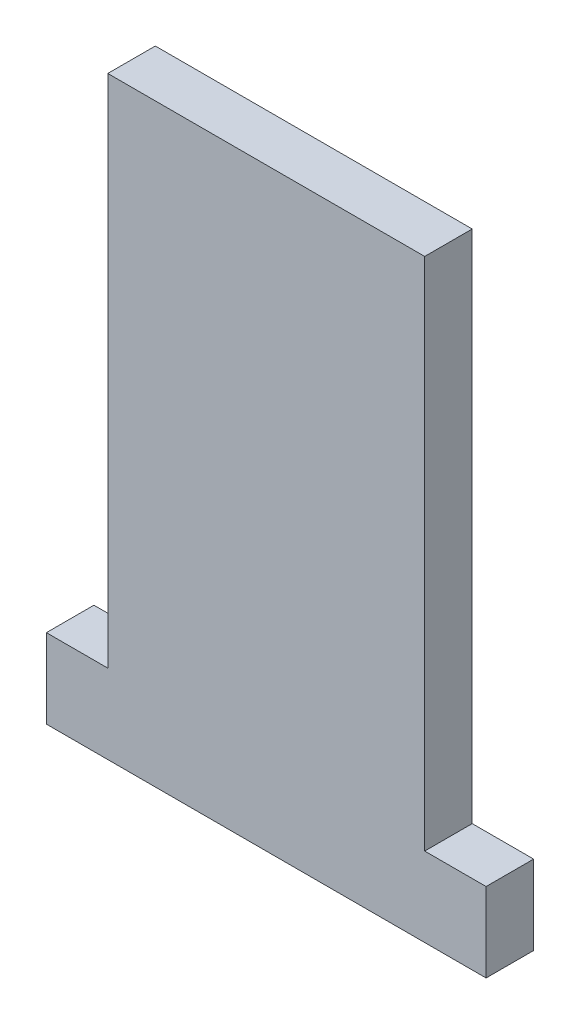
ISO-10303-21;
HEADER;
FILE_DESCRIPTION(('STEP AP214'),'2;1');
FILE_NAME('part.step','',(''),(''),'','','');
FILE_SCHEMA(('AUTOMOTIVE_DESIGN { 1 0 10303 214 1 1 1 1 }'));
ENDSEC;
DATA;
#1=APPLICATION_CONTEXT('core data for automotive mechanical design processes');
#2=APPLICATION_PROTOCOL_DEFINITION('international standard','automotive_design',2000,#1);
#3=PRODUCT_CONTEXT('',#1,'mechanical');
#4=PRODUCT('Part','Part','',(#3));
#5=PRODUCT_RELATED_PRODUCT_CATEGORY('part','',(#4));
#6=PRODUCT_DEFINITION_FORMATION('','',#4);
#7=PRODUCT_DEFINITION_CONTEXT('part definition',#1,'design');
#8=PRODUCT_DEFINITION('design','',#6,#7);
#9=PRODUCT_DEFINITION_SHAPE('','',#8);
#10=(LENGTH_UNIT() NAMED_UNIT(*) SI_UNIT(.MILLI.,.METRE.));
#11=(NAMED_UNIT(*) PLANE_ANGLE_UNIT() SI_UNIT($,.RADIAN.));
#12=(NAMED_UNIT(*) SI_UNIT($,.STERADIAN.) SOLID_ANGLE_UNIT());
#13=UNCERTAINTY_MEASURE_WITH_UNIT(LENGTH_MEASURE(1.E-05),#10,'distance_accuracy_value','');
#14=(GEOMETRIC_REPRESENTATION_CONTEXT(3) GLOBAL_UNCERTAINTY_ASSIGNED_CONTEXT((#13)) GLOBAL_UNIT_ASSIGNED_CONTEXT((#10,
#11,#12)) REPRESENTATION_CONTEXT('',''));
#15=CARTESIAN_POINT('',(0.,0.,0.));
#16=DIRECTION('',(0.,0.,1.));
#17=DIRECTION('',(1.,0.,0.));
#18=AXIS2_PLACEMENT_3D('',#15,#16,#17);
#19=CARTESIAN_POINT('',(4.,6.5,0.6));
#20=DIRECTION('',(-1.,0.,0.));
#21=DIRECTION('',(0.,-1.,0.));
#22=AXIS2_PLACEMENT_3D('',#19,#20,#21);
#23=PLANE('',#22);
#24=DIRECTION('',(0.,1.,0.));
#25=VECTOR('',#24,1.);
#26=CARTESIAN_POINT('',(4.,6.5,-0.6));
#27=LINE('',#26,#25);
#28=CARTESIAN_POINT('',(4.,-6.5,-0.6));
#29=VERTEX_POINT('',#28);
#30=CARTESIAN_POINT('',(4.,6.5,-0.6));
#31=VERTEX_POINT('',#30);
#32=EDGE_CURVE('E142',#29,#31,#27,.T.);
#33=ORIENTED_EDGE('',*,*,#32,.T.);
#34=DIRECTION('',(0.,0.,-1.));
#35=VECTOR('',#34,1.);
#36=CARTESIAN_POINT('',(4.,6.5,0.6));
#37=LINE('',#36,#35);
#38=CARTESIAN_POINT('',(4.,6.5,0.6));
#39=VERTEX_POINT('',#38);
#40=EDGE_CURVE('E11',#39,#31,#37,.T.);
#41=ORIENTED_EDGE('',*,*,#40,.F.);
#42=DIRECTION('',(0.,1.,0.));
#43=VECTOR('',#42,1.);
#44=CARTESIAN_POINT('',(4.,6.5,0.6));
#45=LINE('',#44,#43);
#46=CARTESIAN_POINT('',(4.,-6.5,0.6));
#47=VERTEX_POINT('',#46);
#48=EDGE_CURVE('E49',#47,#39,#45,.T.);
#49=ORIENTED_EDGE('',*,*,#48,.F.);
#50=DIRECTION('',(0.,0.,-1.));
#51=VECTOR('',#50,1.);
#52=CARTESIAN_POINT('',(4.,-6.5,0.6));
#53=LINE('',#52,#51);
#54=EDGE_CURVE('E67',#47,#29,#53,.T.);
#55=ORIENTED_EDGE('',*,*,#54,.T.);
#56=EDGE_LOOP('',(#33,#41,#49,#55));
#57=FACE_BOUND('',#56,.T.);
#58=ADVANCED_FACE('F33',(#57),#23,.F.);
#59=CARTESIAN_POINT('',(-4.,6.5,0.6));
#60=DIRECTION('',(0.,-1.,0.));
#61=DIRECTION('',(0.,0.,-1.));
#62=AXIS2_PLACEMENT_3D('',#59,#60,#61);
#63=PLANE('',#62);
#64=DIRECTION('',(-1.,0.,0.));
#65=VECTOR('',#64,1.);
#66=CARTESIAN_POINT('',(-4.,6.5,-0.6));
#67=LINE('',#66,#65);
#68=CARTESIAN_POINT('',(-4.,6.5,-0.6));
#69=VERTEX_POINT('',#68);
#70=EDGE_CURVE('E63',#31,#69,#67,.T.);
#71=ORIENTED_EDGE('',*,*,#70,.T.);
#72=DIRECTION('',(0.,0.,-1.));
#73=VECTOR('',#72,1.);
#74=CARTESIAN_POINT('',(-4.,6.5,0.6));
#75=LINE('',#74,#73);
#76=CARTESIAN_POINT('',(-4.,6.5,0.6));
#77=VERTEX_POINT('',#76);
#78=EDGE_CURVE('E41',#77,#69,#75,.T.);
#79=ORIENTED_EDGE('',*,*,#78,.F.);
#80=DIRECTION('',(-1.,0.,0.));
#81=VECTOR('',#80,1.);
#82=CARTESIAN_POINT('',(-4.,6.5,0.6));
#83=LINE('',#82,#81);
#84=EDGE_CURVE('E72',#39,#77,#83,.T.);
#85=ORIENTED_EDGE('',*,*,#84,.F.);
#86=ORIENTED_EDGE('',*,*,#40,.T.);
#87=EDGE_LOOP('',(#71,#79,#85,#86));
#88=FACE_BOUND('',#87,.T.);
#89=ADVANCED_FACE('F169',(#88),#63,.F.);
#90=CARTESIAN_POINT('',(-4.,6.5,0.6));
#91=DIRECTION('',(1.,0.,0.));
#92=DIRECTION('',(0.,1.,0.));
#93=AXIS2_PLACEMENT_3D('',#90,#91,#92);
#94=PLANE('',#93);
#95=DIRECTION('',(0.,-1.,0.));
#96=VECTOR('',#95,1.);
#97=CARTESIAN_POINT('',(-4.,6.5,-0.6));
#98=LINE('',#97,#96);
#99=CARTESIAN_POINT('',(-4.,-6.5,-0.6));
#100=VERTEX_POINT('',#99);
#101=EDGE_CURVE('E145',#69,#100,#98,.T.);
#102=ORIENTED_EDGE('',*,*,#101,.T.);
#103=DIRECTION('',(0.,0.,-1.));
#104=VECTOR('',#103,1.);
#105=CARTESIAN_POINT('',(-4.,-6.5,0.6));
#106=LINE('',#105,#104);
#107=CARTESIAN_POINT('',(-4.,-6.5,0.6));
#108=VERTEX_POINT('',#107);
#109=EDGE_CURVE('E153',#108,#100,#106,.T.);
#110=ORIENTED_EDGE('',*,*,#109,.F.);
#111=DIRECTION('',(0.,-1.,0.));
#112=VECTOR('',#111,1.);
#113=CARTESIAN_POINT('',(-4.,6.5,0.6));
#114=LINE('',#113,#112);
#115=EDGE_CURVE('E147',#77,#108,#114,.T.);
#116=ORIENTED_EDGE('',*,*,#115,.F.);
#117=ORIENTED_EDGE('',*,*,#78,.T.);
#118=EDGE_LOOP('',(#102,#110,#116,#117));
#119=FACE_BOUND('',#118,.T.);
#120=ADVANCED_FACE('F158',(#119),#94,.F.);
#121=CARTESIAN_POINT('',(0.,0.,0.6));
#122=DIRECTION('',(0.,0.,1.));
#123=DIRECTION('',(1.,0.,0.));
#124=AXIS2_PLACEMENT_3D('',#121,#122,#123);
#125=PLANE('',#124);
#126=ORIENTED_EDGE('',*,*,#48,.T.);
#127=ORIENTED_EDGE('',*,*,#84,.T.);
#128=ORIENTED_EDGE('',*,*,#115,.T.);
#129=DIRECTION('',(-1.,0.,0.));
#130=VECTOR('',#129,1.);
#131=CARTESIAN_POINT('',(-5.55,-6.5,0.6));
#132=LINE('',#131,#130);
#133=CARTESIAN_POINT('',(-5.55,-6.5,0.6));
#134=VERTEX_POINT('',#133);
#135=EDGE_CURVE('E121',#108,#134,#132,.T.);
#136=ORIENTED_EDGE('',*,*,#135,.T.);
#137=DIRECTION('',(0.,-1.,0.));
#138=VECTOR('',#137,1.);
#139=CARTESIAN_POINT('',(-5.55,-8.5,0.6));
#140=LINE('',#139,#138);
#141=CARTESIAN_POINT('',(-5.55,-8.5,0.6));
#142=VERTEX_POINT('',#141);
#143=EDGE_CURVE('E120',#134,#142,#140,.T.);
#144=ORIENTED_EDGE('',*,*,#143,.T.);
#145=DIRECTION('',(1.,0.,0.));
#146=VECTOR('',#145,1.);
#147=CARTESIAN_POINT('',(-5.55,-8.5,0.6));
#148=LINE('',#147,#146);
#149=CARTESIAN_POINT('',(5.55,-8.5,0.6));
#150=VERTEX_POINT('',#149);
#151=EDGE_CURVE('E114',#142,#150,#148,.T.);
#152=ORIENTED_EDGE('',*,*,#151,.T.);
#153=DIRECTION('',(0.,1.,0.));
#154=VECTOR('',#153,1.);
#155=CARTESIAN_POINT('',(5.55,-8.5,0.6));
#156=LINE('',#155,#154);
#157=CARTESIAN_POINT('',(5.55,-6.5,0.6));
#158=VERTEX_POINT('',#157);
#159=EDGE_CURVE('E108',#150,#158,#156,.T.);
#160=ORIENTED_EDGE('',*,*,#159,.T.);
#161=EDGE_CURVE('E117',#158,#47,#132,.T.);
#162=ORIENTED_EDGE('',*,*,#161,.T.);
#163=EDGE_LOOP('',(#126,#127,#128,#136,#144,#152,#160,#162));
#164=FACE_BOUND('',#163,.T.);
#165=ADVANCED_FACE('F123',(#164),#125,.T.);
#166=CARTESIAN_POINT('',(0.,0.,-0.6));
#167=DIRECTION('',(0.,0.,1.));
#168=DIRECTION('',(1.,0.,0.));
#169=AXIS2_PLACEMENT_3D('',#166,#167,#168);
#170=PLANE('',#169);
#171=ORIENTED_EDGE('',*,*,#32,.F.);
#172=DIRECTION('',(1.,0.,0.));
#173=VECTOR('',#172,1.);
#174=CARTESIAN_POINT('',(-5.55,-6.5,-0.6));
#175=LINE('',#174,#173);
#176=CARTESIAN_POINT('',(5.55,-6.5,-0.6));
#177=VERTEX_POINT('',#176);
#178=EDGE_CURVE('E143',#29,#177,#175,.T.);
#179=ORIENTED_EDGE('',*,*,#178,.T.);
#180=DIRECTION('',(0.,-1.,0.));
#181=VECTOR('',#180,1.);
#182=CARTESIAN_POINT('',(5.55,-8.5,-0.6));
#183=LINE('',#182,#181);
#184=CARTESIAN_POINT('',(5.55,-8.5,-0.6));
#185=VERTEX_POINT('',#184);
#186=EDGE_CURVE('E110',#177,#185,#183,.T.);
#187=ORIENTED_EDGE('',*,*,#186,.T.);
#188=DIRECTION('',(-1.,0.,0.));
#189=VECTOR('',#188,1.);
#190=CARTESIAN_POINT('',(-5.55,-8.5,-0.6));
#191=LINE('',#190,#189);
#192=CARTESIAN_POINT('',(-5.55,-8.5,-0.6));
#193=VERTEX_POINT('',#192);
#194=EDGE_CURVE('E196',#185,#193,#191,.T.);
#195=ORIENTED_EDGE('',*,*,#194,.T.);
#196=DIRECTION('',(0.,1.,0.));
#197=VECTOR('',#196,1.);
#198=CARTESIAN_POINT('',(-5.55,-8.5,-0.6));
#199=LINE('',#198,#197);
#200=CARTESIAN_POINT('',(-5.55,-6.5,-0.6));
#201=VERTEX_POINT('',#200);
#202=EDGE_CURVE('E134',#193,#201,#199,.T.);
#203=ORIENTED_EDGE('',*,*,#202,.T.);
#204=EDGE_CURVE('E139',#201,#100,#175,.T.);
#205=ORIENTED_EDGE('',*,*,#204,.T.);
#206=ORIENTED_EDGE('',*,*,#101,.F.);
#207=ORIENTED_EDGE('',*,*,#70,.F.);
#208=EDGE_LOOP('',(#171,#179,#187,#195,#203,#205,#206,#207));
#209=FACE_BOUND('',#208,.T.);
#210=ADVANCED_FACE('F161',(#209),#170,.F.);
#211=CARTESIAN_POINT('',(-5.55,-6.5,-11.8787410644983));
#212=DIRECTION('',(0.,1.,0.));
#213=DIRECTION('',(0.,0.,1.));
#214=AXIS2_PLACEMENT_3D('',#211,#212,#213);
#215=PLANE('',#214);
#216=ORIENTED_EDGE('',*,*,#54,.F.);
#217=ORIENTED_EDGE('',*,*,#161,.F.);
#218=DIRECTION('',(0.,0.,1.));
#219=VECTOR('',#218,1.);
#220=CARTESIAN_POINT('',(5.55,-6.5,-11.8787410644983));
#221=LINE('',#220,#219);
#222=EDGE_CURVE('E103',#177,#158,#221,.T.);
#223=ORIENTED_EDGE('',*,*,#222,.F.);
#224=ORIENTED_EDGE('',*,*,#178,.F.);
#225=EDGE_LOOP('',(#216,#217,#223,#224));
#226=FACE_BOUND('',#225,.T.);
#227=ADVANCED_FACE('F118',(#226),#215,.T.);
#228=CARTESIAN_POINT('',(5.55,-8.5,-11.8787410644983));
#229=DIRECTION('',(1.,0.,0.));
#230=DIRECTION('',(0.,0.,-1.));
#231=AXIS2_PLACEMENT_3D('',#228,#229,#230);
#232=PLANE('',#231);
#233=ORIENTED_EDGE('',*,*,#186,.F.);
#234=ORIENTED_EDGE('',*,*,#222,.T.);
#235=ORIENTED_EDGE('',*,*,#159,.F.);
#236=DIRECTION('',(0.,0.,1.));
#237=VECTOR('',#236,1.);
#238=CARTESIAN_POINT('',(5.55,-8.5,-11.8787410644983));
#239=LINE('',#238,#237);
#240=EDGE_CURVE('E132',#185,#150,#239,.T.);
#241=ORIENTED_EDGE('',*,*,#240,.F.);
#242=EDGE_LOOP('',(#233,#234,#235,#241));
#243=FACE_BOUND('',#242,.T.);
#244=ADVANCED_FACE('F105',(#243),#232,.T.);
#245=CARTESIAN_POINT('',(-5.55,-8.5,-11.8787410644983));
#246=DIRECTION('',(0.,-1.,0.));
#247=DIRECTION('',(0.,0.,-1.));
#248=AXIS2_PLACEMENT_3D('',#245,#246,#247);
#249=PLANE('',#248);
#250=ORIENTED_EDGE('',*,*,#194,.F.);
#251=ORIENTED_EDGE('',*,*,#240,.T.);
#252=ORIENTED_EDGE('',*,*,#151,.F.);
#253=DIRECTION('',(0.,0.,1.));
#254=VECTOR('',#253,1.);
#255=CARTESIAN_POINT('',(-5.55,-8.5,-11.8787410644983));
#256=LINE('',#255,#254);
#257=EDGE_CURVE('E135',#193,#142,#256,.T.);
#258=ORIENTED_EDGE('',*,*,#257,.F.);
#259=EDGE_LOOP('',(#250,#251,#252,#258));
#260=FACE_BOUND('',#259,.T.);
#261=ADVANCED_FACE('F183',(#260),#249,.T.);
#262=CARTESIAN_POINT('',(-5.55,-8.5,-11.8787410644983));
#263=DIRECTION('',(-1.,0.,0.));
#264=DIRECTION('',(0.,0.,1.));
#265=AXIS2_PLACEMENT_3D('',#262,#263,#264);
#266=PLANE('',#265);
#267=ORIENTED_EDGE('',*,*,#202,.F.);
#268=ORIENTED_EDGE('',*,*,#257,.T.);
#269=ORIENTED_EDGE('',*,*,#143,.F.);
#270=DIRECTION('',(0.,0.,1.));
#271=VECTOR('',#270,1.);
#272=CARTESIAN_POINT('',(-5.55,-6.5,-11.8787410644983));
#273=LINE('',#272,#271);
#274=EDGE_CURVE('E113',#201,#134,#273,.T.);
#275=ORIENTED_EDGE('',*,*,#274,.F.);
#276=EDGE_LOOP('',(#267,#268,#269,#275));
#277=FACE_BOUND('',#276,.T.);
#278=ADVANCED_FACE('F186',(#277),#266,.T.);
#279=ORIENTED_EDGE('',*,*,#135,.F.);
#280=ORIENTED_EDGE('',*,*,#109,.T.);
#281=ORIENTED_EDGE('',*,*,#204,.F.);
#282=ORIENTED_EDGE('',*,*,#274,.T.);
#283=EDGE_LOOP('',(#279,#280,#281,#282));
#284=FACE_BOUND('',#283,.T.);
#285=ADVANCED_FACE('F167',(#284),#215,.T.);
#286=CLOSED_SHELL('',(#58,#89,#120,#165,#210,#227,#244,#261,#278,#285));
#287=MANIFOLD_SOLID_BREP('B2',#286);
#288=ADVANCED_BREP_SHAPE_REPRESENTATION('',(#18,#287),#14);
#289=SHAPE_DEFINITION_REPRESENTATION(#9,#288);
ENDSEC;
END-ISO-10303-21;
